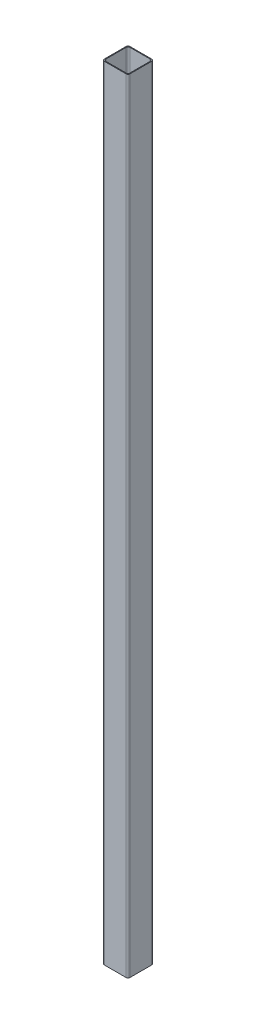
ISO-10303-21;
HEADER;
FILE_DESCRIPTION(('STEP AP214'),'2;1');
FILE_NAME('part.step','',(''),(''),'','','');
FILE_SCHEMA(('AUTOMOTIVE_DESIGN { 1 0 10303 214 1 1 1 1 }'));
ENDSEC;
DATA;
#1=APPLICATION_CONTEXT('core data for automotive mechanical design processes');
#2=APPLICATION_PROTOCOL_DEFINITION('international standard','automotive_design',2000,#1);
#3=PRODUCT_CONTEXT('',#1,'mechanical');
#4=PRODUCT('Part','Part','',(#3));
#5=PRODUCT_RELATED_PRODUCT_CATEGORY('part','',(#4));
#6=PRODUCT_DEFINITION_FORMATION('','',#4);
#7=PRODUCT_DEFINITION_CONTEXT('part definition',#1,'design');
#8=PRODUCT_DEFINITION('design','',#6,#7);
#9=PRODUCT_DEFINITION_SHAPE('','',#8);
#10=(LENGTH_UNIT() NAMED_UNIT(*) SI_UNIT(.MILLI.,.METRE.));
#11=(NAMED_UNIT(*) PLANE_ANGLE_UNIT() SI_UNIT($,.RADIAN.));
#12=(NAMED_UNIT(*) SI_UNIT($,.STERADIAN.) SOLID_ANGLE_UNIT());
#13=UNCERTAINTY_MEASURE_WITH_UNIT(LENGTH_MEASURE(1.E-05),#10,'distance_accuracy_value','');
#14=(GEOMETRIC_REPRESENTATION_CONTEXT(3) GLOBAL_UNCERTAINTY_ASSIGNED_CONTEXT((#13)) GLOBAL_UNIT_ASSIGNED_CONTEXT((#10,
#11,#12)) REPRESENTATION_CONTEXT('',''));
#15=CARTESIAN_POINT('',(0.,0.,0.));
#16=DIRECTION('',(0.,0.,1.));
#17=DIRECTION('',(1.,0.,0.));
#18=AXIS2_PLACEMENT_3D('',#15,#16,#17);
#19=CARTESIAN_POINT('',(0.,610.,0.));
#20=DIRECTION('',(0.,1.,0.));
#21=DIRECTION('',(0.,0.,1.));
#22=AXIS2_PLACEMENT_3D('',#19,#20,#21);
#23=PLANE('',#22);
#24=DIRECTION('',(-1.,0.,0.));
#25=VECTOR('',#24,1.);
#26=CARTESIAN_POINT('',(20.,610.,-20.));
#27=LINE('',#26,#25);
#28=CARTESIAN_POINT('',(17.,610.,-20.));
#29=VERTEX_POINT('',#28);
#30=CARTESIAN_POINT('',(-17.,610.,-20.));
#31=VERTEX_POINT('',#30);
#32=EDGE_CURVE('E183',#29,#31,#27,.T.);
#33=ORIENTED_EDGE('',*,*,#32,.T.);
#34=CARTESIAN_POINT('',(-17.,610.,-17.));
#35=DIRECTION('',(0.,1.,0.));
#36=DIRECTION('',(0.,0.,1.));
#37=AXIS2_PLACEMENT_3D('',#34,#35,#36);
#38=CIRCLE('',#37,3.);
#39=CARTESIAN_POINT('',(-20.,610.,-17.));
#40=VERTEX_POINT('',#39);
#41=EDGE_CURVE('E203',#31,#40,#38,.T.);
#42=ORIENTED_EDGE('',*,*,#41,.T.);
#43=DIRECTION('',(0.,0.,1.));
#44=VECTOR('',#43,1.);
#45=CARTESIAN_POINT('',(-20.,610.,20.));
#46=LINE('',#45,#44);
#47=CARTESIAN_POINT('',(-20.,610.,17.));
#48=VERTEX_POINT('',#47);
#49=EDGE_CURVE('E165',#40,#48,#46,.T.);
#50=ORIENTED_EDGE('',*,*,#49,.T.);
#51=CARTESIAN_POINT('',(-17.,610.,17.));
#52=DIRECTION('',(0.,1.,0.));
#53=DIRECTION('',(0.,0.,1.));
#54=AXIS2_PLACEMENT_3D('',#51,#52,#53);
#55=CIRCLE('',#54,3.);
#56=CARTESIAN_POINT('',(-17.,610.,20.));
#57=VERTEX_POINT('',#56);
#58=EDGE_CURVE('E199',#48,#57,#55,.T.);
#59=ORIENTED_EDGE('',*,*,#58,.T.);
#60=DIRECTION('',(1.,0.,0.));
#61=VECTOR('',#60,1.);
#62=CARTESIAN_POINT('',(20.,610.,20.));
#63=LINE('',#62,#61);
#64=CARTESIAN_POINT('',(17.,610.,20.));
#65=VERTEX_POINT('',#64);
#66=EDGE_CURVE('E275',#57,#65,#63,.T.);
#67=ORIENTED_EDGE('',*,*,#66,.T.);
#68=CARTESIAN_POINT('',(17.,610.,17.));
#69=DIRECTION('',(0.,1.,0.));
#70=DIRECTION('',(0.,0.,1.));
#71=AXIS2_PLACEMENT_3D('',#68,#69,#70);
#72=CIRCLE('',#71,3.);
#73=CARTESIAN_POINT('',(20.,610.,17.));
#74=VERTEX_POINT('',#73);
#75=EDGE_CURVE('E197',#65,#74,#72,.T.);
#76=ORIENTED_EDGE('',*,*,#75,.T.);
#77=DIRECTION('',(0.,0.,-1.));
#78=VECTOR('',#77,1.);
#79=CARTESIAN_POINT('',(20.,610.,20.));
#80=LINE('',#79,#78);
#81=CARTESIAN_POINT('',(20.,610.,-17.));
#82=VERTEX_POINT('',#81);
#83=EDGE_CURVE('E277',#74,#82,#80,.T.);
#84=ORIENTED_EDGE('',*,*,#83,.T.);
#85=CARTESIAN_POINT('',(17.,610.,-17.));
#86=DIRECTION('',(0.,1.,0.));
#87=DIRECTION('',(0.,0.,1.));
#88=AXIS2_PLACEMENT_3D('',#85,#86,#87);
#89=CIRCLE('',#88,3.);
#90=EDGE_CURVE('E201',#82,#29,#89,.T.);
#91=ORIENTED_EDGE('',*,*,#90,.T.);
#92=EDGE_LOOP('',(#33,#42,#50,#59,#67,#76,#84,#91));
#93=FACE_BOUND('',#92,.T.);
#94=DIRECTION('',(0.,0.,-1.));
#95=VECTOR('',#94,1.);
#96=CARTESIAN_POINT('',(18.8,610.,18.8));
#97=LINE('',#96,#95);
#98=CARTESIAN_POINT('',(18.8,610.,15.8));
#99=VERTEX_POINT('',#98);
#100=CARTESIAN_POINT('',(18.8,610.,-15.8));
#101=VERTEX_POINT('',#100);
#102=EDGE_CURVE('E261',#99,#101,#97,.T.);
#103=ORIENTED_EDGE('',*,*,#102,.F.);
#104=CARTESIAN_POINT('',(15.8,610.,15.8));
#105=DIRECTION('',(0.,1.,0.));
#106=DIRECTION('',(0.,0.,1.));
#107=AXIS2_PLACEMENT_3D('',#104,#105,#106);
#108=CIRCLE('',#107,3.);
#109=CARTESIAN_POINT('',(15.8,610.,18.8));
#110=VERTEX_POINT('',#109);
#111=EDGE_CURVE('E240',#99,#110,#108,.F.);
#112=ORIENTED_EDGE('',*,*,#111,.T.);
#113=DIRECTION('',(1.,0.,0.));
#114=VECTOR('',#113,1.);
#115=CARTESIAN_POINT('',(18.8,610.,18.8));
#116=LINE('',#115,#114);
#117=CARTESIAN_POINT('',(-15.8,610.,18.8));
#118=VERTEX_POINT('',#117);
#119=EDGE_CURVE('E256',#118,#110,#116,.T.);
#120=ORIENTED_EDGE('',*,*,#119,.F.);
#121=CARTESIAN_POINT('',(-15.8,610.,15.8));
#122=DIRECTION('',(0.,1.,0.));
#123=DIRECTION('',(0.,0.,1.));
#124=AXIS2_PLACEMENT_3D('',#121,#122,#123);
#125=CIRCLE('',#124,3.);
#126=CARTESIAN_POINT('',(-18.8,610.,15.8));
#127=VERTEX_POINT('',#126);
#128=EDGE_CURVE('E244',#118,#127,#125,.F.);
#129=ORIENTED_EDGE('',*,*,#128,.T.);
#130=DIRECTION('',(0.,0.,1.));
#131=VECTOR('',#130,1.);
#132=CARTESIAN_POINT('',(-18.8,610.,18.8));
#133=LINE('',#132,#131);
#134=CARTESIAN_POINT('',(-18.8,610.,-15.8));
#135=VERTEX_POINT('',#134);
#136=EDGE_CURVE('E174',#135,#127,#133,.T.);
#137=ORIENTED_EDGE('',*,*,#136,.F.);
#138=CARTESIAN_POINT('',(-15.8,610.,-15.8));
#139=DIRECTION('',(0.,1.,0.));
#140=DIRECTION('',(0.,0.,1.));
#141=AXIS2_PLACEMENT_3D('',#138,#139,#140);
#142=CIRCLE('',#141,3.);
#143=CARTESIAN_POINT('',(-15.8,610.,-18.8));
#144=VERTEX_POINT('',#143);
#145=EDGE_CURVE('E11',#135,#144,#142,.F.);
#146=ORIENTED_EDGE('',*,*,#145,.T.);
#147=DIRECTION('',(-1.,0.,0.));
#148=VECTOR('',#147,1.);
#149=CARTESIAN_POINT('',(18.8,610.,-18.8));
#150=LINE('',#149,#148);
#151=CARTESIAN_POINT('',(15.8,610.,-18.8));
#152=VERTEX_POINT('',#151);
#153=EDGE_CURVE('E180',#152,#144,#150,.T.);
#154=ORIENTED_EDGE('',*,*,#153,.F.);
#155=CARTESIAN_POINT('',(15.8,610.,-15.8));
#156=DIRECTION('',(0.,1.,0.));
#157=DIRECTION('',(0.,0.,1.));
#158=AXIS2_PLACEMENT_3D('',#155,#156,#157);
#159=CIRCLE('',#158,3.);
#160=EDGE_CURVE('E236',#152,#101,#159,.F.);
#161=ORIENTED_EDGE('',*,*,#160,.T.);
#162=EDGE_LOOP('',(#103,#112,#120,#129,#137,#146,#154,#161));
#163=FACE_BOUND('',#162,.T.);
#164=ADVANCED_FACE('F32',(#93,#163),#23,.T.);
#165=CARTESIAN_POINT('',(0.,-610.,0.));
#166=DIRECTION('',(0.,1.,0.));
#167=DIRECTION('',(0.,0.,1.));
#168=AXIS2_PLACEMENT_3D('',#165,#166,#167);
#169=PLANE('',#168);
#170=DIRECTION('',(0.,0.,1.));
#171=VECTOR('',#170,1.);
#172=CARTESIAN_POINT('',(-20.,-610.,20.));
#173=LINE('',#172,#171);
#174=CARTESIAN_POINT('',(-20.,-610.,-17.));
#175=VERTEX_POINT('',#174);
#176=CARTESIAN_POINT('',(-20.,-610.,17.));
#177=VERTEX_POINT('',#176);
#178=EDGE_CURVE('E162',#175,#177,#173,.T.);
#179=ORIENTED_EDGE('',*,*,#178,.F.);
#180=CARTESIAN_POINT('',(-17.,-610.,-17.));
#181=DIRECTION('',(0.,1.,0.));
#182=DIRECTION('',(0.,0.,1.));
#183=AXIS2_PLACEMENT_3D('',#180,#181,#182);
#184=CIRCLE('',#183,3.);
#185=CARTESIAN_POINT('',(-17.,-610.,-20.));
#186=VERTEX_POINT('',#185);
#187=EDGE_CURVE('E145',#175,#186,#184,.F.);
#188=ORIENTED_EDGE('',*,*,#187,.T.);
#189=DIRECTION('',(-1.,0.,0.));
#190=VECTOR('',#189,1.);
#191=CARTESIAN_POINT('',(20.,-610.,-20.));
#192=LINE('',#191,#190);
#193=CARTESIAN_POINT('',(17.,-610.,-20.));
#194=VERTEX_POINT('',#193);
#195=EDGE_CURVE('E188',#194,#186,#192,.T.);
#196=ORIENTED_EDGE('',*,*,#195,.F.);
#197=CARTESIAN_POINT('',(17.,-610.,-17.));
#198=DIRECTION('',(0.,1.,0.));
#199=DIRECTION('',(0.,0.,1.));
#200=AXIS2_PLACEMENT_3D('',#197,#198,#199);
#201=CIRCLE('',#200,3.);
#202=CARTESIAN_POINT('',(20.,-610.,-17.));
#203=VERTEX_POINT('',#202);
#204=EDGE_CURVE('E156',#194,#203,#201,.F.);
#205=ORIENTED_EDGE('',*,*,#204,.T.);
#206=DIRECTION('',(0.,0.,-1.));
#207=VECTOR('',#206,1.);
#208=CARTESIAN_POINT('',(20.,-610.,20.));
#209=LINE('',#208,#207);
#210=CARTESIAN_POINT('',(20.,-610.,17.));
#211=VERTEX_POINT('',#210);
#212=EDGE_CURVE('E177',#211,#203,#209,.T.);
#213=ORIENTED_EDGE('',*,*,#212,.F.);
#214=CARTESIAN_POINT('',(17.,-610.,17.));
#215=DIRECTION('',(0.,1.,0.));
#216=DIRECTION('',(0.,0.,1.));
#217=AXIS2_PLACEMENT_3D('',#214,#215,#216);
#218=CIRCLE('',#217,3.);
#219=CARTESIAN_POINT('',(17.,-610.,20.));
#220=VERTEX_POINT('',#219);
#221=EDGE_CURVE('E166',#211,#220,#218,.F.);
#222=ORIENTED_EDGE('',*,*,#221,.T.);
#223=DIRECTION('',(1.,0.,0.));
#224=VECTOR('',#223,1.);
#225=CARTESIAN_POINT('',(20.,-610.,20.));
#226=LINE('',#225,#224);
#227=CARTESIAN_POINT('',(-17.,-610.,20.));
#228=VERTEX_POINT('',#227);
#229=EDGE_CURVE('E173',#228,#220,#226,.T.);
#230=ORIENTED_EDGE('',*,*,#229,.F.);
#231=CARTESIAN_POINT('',(-17.,-610.,17.));
#232=DIRECTION('',(0.,1.,0.));
#233=DIRECTION('',(0.,0.,1.));
#234=AXIS2_PLACEMENT_3D('',#231,#232,#233);
#235=CIRCLE('',#234,3.);
#236=EDGE_CURVE('E172',#228,#177,#235,.F.);
#237=ORIENTED_EDGE('',*,*,#236,.T.);
#238=EDGE_LOOP('',(#179,#188,#196,#205,#213,#222,#230,#237));
#239=FACE_BOUND('',#238,.T.);
#240=DIRECTION('',(0.,0.,1.));
#241=VECTOR('',#240,1.);
#242=CARTESIAN_POINT('',(-18.8,-610.,18.8));
#243=LINE('',#242,#241);
#244=CARTESIAN_POINT('',(-18.8,-610.,-15.8));
#245=VERTEX_POINT('',#244);
#246=CARTESIAN_POINT('',(-18.8,-610.,15.8));
#247=VERTEX_POINT('',#246);
#248=EDGE_CURVE('E248',#245,#247,#243,.T.);
#249=ORIENTED_EDGE('',*,*,#248,.T.);
#250=CARTESIAN_POINT('',(-15.8,-610.,15.8));
#251=DIRECTION('',(0.,1.,0.));
#252=DIRECTION('',(0.,0.,1.));
#253=AXIS2_PLACEMENT_3D('',#250,#251,#252);
#254=CIRCLE('',#253,3.);
#255=CARTESIAN_POINT('',(-15.8,-610.,18.8));
#256=VERTEX_POINT('',#255);
#257=EDGE_CURVE('E242',#247,#256,#254,.T.);
#258=ORIENTED_EDGE('',*,*,#257,.T.);
#259=DIRECTION('',(1.,0.,0.));
#260=VECTOR('',#259,1.);
#261=CARTESIAN_POINT('',(18.8,-610.,18.8));
#262=LINE('',#261,#260);
#263=CARTESIAN_POINT('',(15.8,-610.,18.8));
#264=VERTEX_POINT('',#263);
#265=EDGE_CURVE('E267',#256,#264,#262,.T.);
#266=ORIENTED_EDGE('',*,*,#265,.T.);
#267=CARTESIAN_POINT('',(15.8,-610.,15.8));
#268=DIRECTION('',(0.,1.,0.));
#269=DIRECTION('',(0.,0.,1.));
#270=AXIS2_PLACEMENT_3D('',#267,#268,#269);
#271=CIRCLE('',#270,3.);
#272=CARTESIAN_POINT('',(18.8,-610.,15.8));
#273=VERTEX_POINT('',#272);
#274=EDGE_CURVE('E238',#264,#273,#271,.T.);
#275=ORIENTED_EDGE('',*,*,#274,.T.);
#276=DIRECTION('',(0.,0.,-1.));
#277=VECTOR('',#276,1.);
#278=CARTESIAN_POINT('',(18.8,-610.,18.8));
#279=LINE('',#278,#277);
#280=CARTESIAN_POINT('',(18.8,-610.,-15.8));
#281=VERTEX_POINT('',#280);
#282=EDGE_CURVE('E270',#273,#281,#279,.T.);
#283=ORIENTED_EDGE('',*,*,#282,.T.);
#284=CARTESIAN_POINT('',(15.8,-610.,-15.8));
#285=DIRECTION('',(0.,1.,0.));
#286=DIRECTION('',(0.,0.,1.));
#287=AXIS2_PLACEMENT_3D('',#284,#285,#286);
#288=CIRCLE('',#287,3.);
#289=CARTESIAN_POINT('',(15.8,-610.,-18.8));
#290=VERTEX_POINT('',#289);
#291=EDGE_CURVE('E234',#281,#290,#288,.T.);
#292=ORIENTED_EDGE('',*,*,#291,.T.);
#293=DIRECTION('',(-1.,0.,0.));
#294=VECTOR('',#293,1.);
#295=CARTESIAN_POINT('',(18.8,-610.,-18.8));
#296=LINE('',#295,#294);
#297=CARTESIAN_POINT('',(-15.8,-610.,-18.8));
#298=VERTEX_POINT('',#297);
#299=EDGE_CURVE('E249',#290,#298,#296,.T.);
#300=ORIENTED_EDGE('',*,*,#299,.T.);
#301=CARTESIAN_POINT('',(-15.8,-610.,-15.8));
#302=DIRECTION('',(0.,1.,0.));
#303=DIRECTION('',(0.,0.,1.));
#304=AXIS2_PLACEMENT_3D('',#301,#302,#303);
#305=CIRCLE('',#304,3.);
#306=EDGE_CURVE('E40',#298,#245,#305,.T.);
#307=ORIENTED_EDGE('',*,*,#306,.T.);
#308=EDGE_LOOP('',(#249,#258,#266,#275,#283,#292,#300,#307));
#309=FACE_BOUND('',#308,.T.);
#310=ADVANCED_FACE('F169',(#239,#309),#169,.F.);
#311=CARTESIAN_POINT('',(-20.,610.,20.));
#312=DIRECTION('',(1.,0.,0.));
#313=DIRECTION('',(0.,0.,-1.));
#314=AXIS2_PLACEMENT_3D('',#311,#312,#313);
#315=PLANE('',#314);
#316=ORIENTED_EDGE('',*,*,#49,.F.);
#317=DIRECTION('',(0.,-1.,0.));
#318=VECTOR('',#317,1.);
#319=CARTESIAN_POINT('',(-20.,610.,-17.));
#320=LINE('',#319,#318);
#321=EDGE_CURVE('E149',#40,#175,#320,.T.);
#322=ORIENTED_EDGE('',*,*,#321,.T.);
#323=ORIENTED_EDGE('',*,*,#178,.T.);
#324=DIRECTION('',(0.,-1.,0.));
#325=VECTOR('',#324,1.);
#326=CARTESIAN_POINT('',(-20.,610.,17.));
#327=LINE('',#326,#325);
#328=EDGE_CURVE('E167',#177,#48,#327,.F.);
#329=ORIENTED_EDGE('',*,*,#328,.T.);
#330=EDGE_LOOP('',(#316,#322,#323,#329));
#331=FACE_BOUND('',#330,.T.);
#332=ADVANCED_FACE('F161',(#331),#315,.F.);
#333=CARTESIAN_POINT('',(20.,610.,20.));
#334=DIRECTION('',(0.,0.,-1.));
#335=DIRECTION('',(-1.,0.,0.));
#336=AXIS2_PLACEMENT_3D('',#333,#334,#335);
#337=PLANE('',#336);
#338=ORIENTED_EDGE('',*,*,#66,.F.);
#339=DIRECTION('',(0.,-1.,0.));
#340=VECTOR('',#339,1.);
#341=CARTESIAN_POINT('',(-17.,610.,20.));
#342=LINE('',#341,#340);
#343=EDGE_CURVE('E231',#57,#228,#342,.T.);
#344=ORIENTED_EDGE('',*,*,#343,.T.);
#345=ORIENTED_EDGE('',*,*,#229,.T.);
#346=DIRECTION('',(0.,-1.,0.));
#347=VECTOR('',#346,1.);
#348=CARTESIAN_POINT('',(17.,610.,20.));
#349=LINE('',#348,#347);
#350=EDGE_CURVE('E229',#220,#65,#349,.F.);
#351=ORIENTED_EDGE('',*,*,#350,.T.);
#352=EDGE_LOOP('',(#338,#344,#345,#351));
#353=FACE_BOUND('',#352,.T.);
#354=ADVANCED_FACE('F299',(#353),#337,.F.);
#355=CARTESIAN_POINT('',(20.,610.,20.));
#356=DIRECTION('',(-1.,0.,0.));
#357=DIRECTION('',(0.,0.,1.));
#358=AXIS2_PLACEMENT_3D('',#355,#356,#357);
#359=PLANE('',#358);
#360=ORIENTED_EDGE('',*,*,#212,.T.);
#361=DIRECTION('',(0.,-1.,0.));
#362=VECTOR('',#361,1.);
#363=CARTESIAN_POINT('',(20.,610.,-17.));
#364=LINE('',#363,#362);
#365=EDGE_CURVE('E208',#203,#82,#364,.F.);
#366=ORIENTED_EDGE('',*,*,#365,.T.);
#367=ORIENTED_EDGE('',*,*,#83,.F.);
#368=DIRECTION('',(0.,-1.,0.));
#369=VECTOR('',#368,1.);
#370=CARTESIAN_POINT('',(20.,610.,17.));
#371=LINE('',#370,#369);
#372=EDGE_CURVE('E205',#74,#211,#371,.T.);
#373=ORIENTED_EDGE('',*,*,#372,.T.);
#374=EDGE_LOOP('',(#360,#366,#367,#373));
#375=FACE_BOUND('',#374,.T.);
#376=ADVANCED_FACE('F292',(#375),#359,.F.);
#377=CARTESIAN_POINT('',(20.,610.,-20.));
#378=DIRECTION('',(0.,0.,1.));
#379=DIRECTION('',(1.,0.,0.));
#380=AXIS2_PLACEMENT_3D('',#377,#378,#379);
#381=PLANE('',#380);
#382=ORIENTED_EDGE('',*,*,#195,.T.);
#383=DIRECTION('',(0.,-1.,0.));
#384=VECTOR('',#383,1.);
#385=CARTESIAN_POINT('',(-17.,610.,-20.));
#386=LINE('',#385,#384);
#387=EDGE_CURVE('E150',#186,#31,#386,.F.);
#388=ORIENTED_EDGE('',*,*,#387,.T.);
#389=ORIENTED_EDGE('',*,*,#32,.F.);
#390=DIRECTION('',(0.,-1.,0.));
#391=VECTOR('',#390,1.);
#392=CARTESIAN_POINT('',(17.,610.,-20.));
#393=LINE('',#392,#391);
#394=EDGE_CURVE('E155',#29,#194,#393,.T.);
#395=ORIENTED_EDGE('',*,*,#394,.T.);
#396=EDGE_LOOP('',(#382,#388,#389,#395));
#397=FACE_BOUND('',#396,.T.);
#398=ADVANCED_FACE('F286',(#397),#381,.F.);
#399=CARTESIAN_POINT('',(18.8,610.,18.8));
#400=DIRECTION('',(0.,0.,-1.));
#401=DIRECTION('',(-1.,0.,0.));
#402=AXIS2_PLACEMENT_3D('',#399,#400,#401);
#403=PLANE('',#402);
#404=ORIENTED_EDGE('',*,*,#119,.T.);
#405=DIRECTION('',(0.,-1.,0.));
#406=VECTOR('',#405,1.);
#407=CARTESIAN_POINT('',(15.8,-610.,18.8));
#408=LINE('',#407,#406);
#409=EDGE_CURVE('E221',#110,#264,#408,.T.);
#410=ORIENTED_EDGE('',*,*,#409,.T.);
#411=ORIENTED_EDGE('',*,*,#265,.F.);
#412=DIRECTION('',(0.,-1.,0.));
#413=VECTOR('',#412,1.);
#414=CARTESIAN_POINT('',(-15.8,610.,18.8));
#415=LINE('',#414,#413);
#416=EDGE_CURVE('E219',#256,#118,#415,.F.);
#417=ORIENTED_EDGE('',*,*,#416,.T.);
#418=EDGE_LOOP('',(#404,#410,#411,#417));
#419=FACE_BOUND('',#418,.T.);
#420=ADVANCED_FACE('F318',(#419),#403,.T.);
#421=CARTESIAN_POINT('',(18.8,610.,18.8));
#422=DIRECTION('',(-1.,0.,0.));
#423=DIRECTION('',(0.,0.,1.));
#424=AXIS2_PLACEMENT_3D('',#421,#422,#423);
#425=PLANE('',#424);
#426=ORIENTED_EDGE('',*,*,#102,.T.);
#427=DIRECTION('',(0.,-1.,0.));
#428=VECTOR('',#427,1.);
#429=CARTESIAN_POINT('',(18.8,-610.,-15.8));
#430=LINE('',#429,#428);
#431=EDGE_CURVE('E212',#101,#281,#430,.T.);
#432=ORIENTED_EDGE('',*,*,#431,.T.);
#433=ORIENTED_EDGE('',*,*,#282,.F.);
#434=DIRECTION('',(0.,-1.,0.));
#435=VECTOR('',#434,1.);
#436=CARTESIAN_POINT('',(18.8,610.,15.8));
#437=LINE('',#436,#435);
#438=EDGE_CURVE('E210',#273,#99,#437,.F.);
#439=ORIENTED_EDGE('',*,*,#438,.T.);
#440=EDGE_LOOP('',(#426,#432,#433,#439));
#441=FACE_BOUND('',#440,.T.);
#442=ADVANCED_FACE('F357',(#441),#425,.T.);
#443=CARTESIAN_POINT('',(18.8,610.,-18.8));
#444=DIRECTION('',(0.,0.,1.));
#445=DIRECTION('',(1.,0.,0.));
#446=AXIS2_PLACEMENT_3D('',#443,#444,#445);
#447=PLANE('',#446);
#448=ORIENTED_EDGE('',*,*,#299,.F.);
#449=DIRECTION('',(0.,-1.,0.));
#450=VECTOR('',#449,1.);
#451=CARTESIAN_POINT('',(15.8,610.,-18.8));
#452=LINE('',#451,#450);
#453=EDGE_CURVE('E52',#290,#152,#452,.F.);
#454=ORIENTED_EDGE('',*,*,#453,.T.);
#455=ORIENTED_EDGE('',*,*,#153,.T.);
#456=DIRECTION('',(0.,-1.,0.));
#457=VECTOR('',#456,1.);
#458=CARTESIAN_POINT('',(-15.8,-610.,-18.8));
#459=LINE('',#458,#457);
#460=EDGE_CURVE('E215',#144,#298,#459,.T.);
#461=ORIENTED_EDGE('',*,*,#460,.T.);
#462=EDGE_LOOP('',(#448,#454,#455,#461));
#463=FACE_BOUND('',#462,.T.);
#464=ADVANCED_FACE('F259',(#463),#447,.T.);
#465=CARTESIAN_POINT('',(-18.8,610.,18.8));
#466=DIRECTION('',(1.,0.,0.));
#467=DIRECTION('',(0.,0.,-1.));
#468=AXIS2_PLACEMENT_3D('',#465,#466,#467);
#469=PLANE('',#468);
#470=ORIENTED_EDGE('',*,*,#136,.T.);
#471=DIRECTION('',(0.,-1.,0.));
#472=VECTOR('',#471,1.);
#473=CARTESIAN_POINT('',(-18.8,-610.,15.8));
#474=LINE('',#473,#472);
#475=EDGE_CURVE('E226',#127,#247,#474,.T.);
#476=ORIENTED_EDGE('',*,*,#475,.T.);
#477=ORIENTED_EDGE('',*,*,#248,.F.);
#478=DIRECTION('',(0.,-1.,0.));
#479=VECTOR('',#478,1.);
#480=CARTESIAN_POINT('',(-18.8,610.,-15.8));
#481=LINE('',#480,#479);
#482=EDGE_CURVE('E224',#245,#135,#481,.F.);
#483=ORIENTED_EDGE('',*,*,#482,.T.);
#484=EDGE_LOOP('',(#470,#476,#477,#483));
#485=FACE_BOUND('',#484,.T.);
#486=ADVANCED_FACE('F254',(#485),#469,.T.);
#487=CARTESIAN_POINT('',(-17.,610.,-17.));
#488=DIRECTION('',(0.,-1.,0.));
#489=DIRECTION('',(0.,0.,-1.));
#490=AXIS2_PLACEMENT_3D('',#487,#488,#489);
#491=CYLINDRICAL_SURFACE('',#490,3.);
#492=ORIENTED_EDGE('',*,*,#41,.F.);
#493=ORIENTED_EDGE('',*,*,#387,.F.);
#494=ORIENTED_EDGE('',*,*,#187,.F.);
#495=ORIENTED_EDGE('',*,*,#321,.F.);
#496=EDGE_LOOP('',(#492,#493,#494,#495));
#497=FACE_BOUND('',#496,.T.);
#498=ADVANCED_FACE('F148',(#497),#491,.T.);
#499=CARTESIAN_POINT('',(17.,610.,-17.));
#500=DIRECTION('',(0.,-1.,0.));
#501=DIRECTION('',(0.,0.,-1.));
#502=AXIS2_PLACEMENT_3D('',#499,#500,#501);
#503=CYLINDRICAL_SURFACE('',#502,3.);
#504=ORIENTED_EDGE('',*,*,#90,.F.);
#505=ORIENTED_EDGE('',*,*,#365,.F.);
#506=ORIENTED_EDGE('',*,*,#204,.F.);
#507=ORIENTED_EDGE('',*,*,#394,.F.);
#508=EDGE_LOOP('',(#504,#505,#506,#507));
#509=FACE_BOUND('',#508,.T.);
#510=ADVANCED_FACE('F288',(#509),#503,.T.);
#511=CARTESIAN_POINT('',(15.8,610.,-15.8));
#512=DIRECTION('',(0.,1.,0.));
#513=DIRECTION('',(0.,0.,1.));
#514=AXIS2_PLACEMENT_3D('',#511,#512,#513);
#515=CYLINDRICAL_SURFACE('',#514,3.);
#516=ORIENTED_EDGE('',*,*,#160,.F.);
#517=ORIENTED_EDGE('',*,*,#453,.F.);
#518=ORIENTED_EDGE('',*,*,#291,.F.);
#519=ORIENTED_EDGE('',*,*,#431,.F.);
#520=EDGE_LOOP('',(#516,#517,#518,#519));
#521=FACE_BOUND('',#520,.T.);
#522=ADVANCED_FACE('F333',(#521),#515,.F.);
#523=CARTESIAN_POINT('',(15.8,610.,15.8));
#524=DIRECTION('',(0.,1.,0.));
#525=DIRECTION('',(0.,0.,1.));
#526=AXIS2_PLACEMENT_3D('',#523,#524,#525);
#527=CYLINDRICAL_SURFACE('',#526,3.);
#528=ORIENTED_EDGE('',*,*,#111,.F.);
#529=ORIENTED_EDGE('',*,*,#438,.F.);
#530=ORIENTED_EDGE('',*,*,#274,.F.);
#531=ORIENTED_EDGE('',*,*,#409,.F.);
#532=EDGE_LOOP('',(#528,#529,#530,#531));
#533=FACE_BOUND('',#532,.T.);
#534=ADVANCED_FACE('F336',(#533),#527,.F.);
#535=CARTESIAN_POINT('',(-15.8,610.,15.8));
#536=DIRECTION('',(0.,1.,0.));
#537=DIRECTION('',(0.,0.,1.));
#538=AXIS2_PLACEMENT_3D('',#535,#536,#537);
#539=CYLINDRICAL_SURFACE('',#538,3.);
#540=ORIENTED_EDGE('',*,*,#128,.F.);
#541=ORIENTED_EDGE('',*,*,#416,.F.);
#542=ORIENTED_EDGE('',*,*,#257,.F.);
#543=ORIENTED_EDGE('',*,*,#475,.F.);
#544=EDGE_LOOP('',(#540,#541,#542,#543));
#545=FACE_BOUND('',#544,.T.);
#546=ADVANCED_FACE('F309',(#545),#539,.F.);
#547=CARTESIAN_POINT('',(-15.8,610.,-15.8));
#548=DIRECTION('',(0.,1.,0.));
#549=DIRECTION('',(0.,0.,1.));
#550=AXIS2_PLACEMENT_3D('',#547,#548,#549);
#551=CYLINDRICAL_SURFACE('',#550,3.);
#552=ORIENTED_EDGE('',*,*,#145,.F.);
#553=ORIENTED_EDGE('',*,*,#482,.F.);
#554=ORIENTED_EDGE('',*,*,#306,.F.);
#555=ORIENTED_EDGE('',*,*,#460,.F.);
#556=EDGE_LOOP('',(#552,#553,#554,#555));
#557=FACE_BOUND('',#556,.T.);
#558=ADVANCED_FACE('F258',(#557),#551,.F.);
#559=CARTESIAN_POINT('',(-17.,610.,17.));
#560=DIRECTION('',(0.,-1.,0.));
#561=DIRECTION('',(0.,0.,-1.));
#562=AXIS2_PLACEMENT_3D('',#559,#560,#561);
#563=CYLINDRICAL_SURFACE('',#562,3.);
#564=ORIENTED_EDGE('',*,*,#58,.F.);
#565=ORIENTED_EDGE('',*,*,#328,.F.);
#566=ORIENTED_EDGE('',*,*,#236,.F.);
#567=ORIENTED_EDGE('',*,*,#343,.F.);
#568=EDGE_LOOP('',(#564,#565,#566,#567));
#569=FACE_BOUND('',#568,.T.);
#570=ADVANCED_FACE('F303',(#569),#563,.T.);
#571=CARTESIAN_POINT('',(17.,610.,17.));
#572=DIRECTION('',(0.,-1.,0.));
#573=DIRECTION('',(0.,0.,-1.));
#574=AXIS2_PLACEMENT_3D('',#571,#572,#573);
#575=CYLINDRICAL_SURFACE('',#574,3.);
#576=ORIENTED_EDGE('',*,*,#75,.F.);
#577=ORIENTED_EDGE('',*,*,#350,.F.);
#578=ORIENTED_EDGE('',*,*,#221,.F.);
#579=ORIENTED_EDGE('',*,*,#372,.F.);
#580=EDGE_LOOP('',(#576,#577,#578,#579));
#581=FACE_BOUND('',#580,.T.);
#582=ADVANCED_FACE('F34',(#581),#575,.T.);
#583=CLOSED_SHELL('',(#164,#310,#332,#354,#376,#398,#420,#442,#464,#486,#498,#510,#522,#534,
#546,#558,#570,#582));
#584=MANIFOLD_SOLID_BREP('B2',#583);
#585=ADVANCED_BREP_SHAPE_REPRESENTATION('',(#18,#584),#14);
#586=SHAPE_DEFINITION_REPRESENTATION(#9,#585);
ENDSEC;
END-ISO-10303-21;
